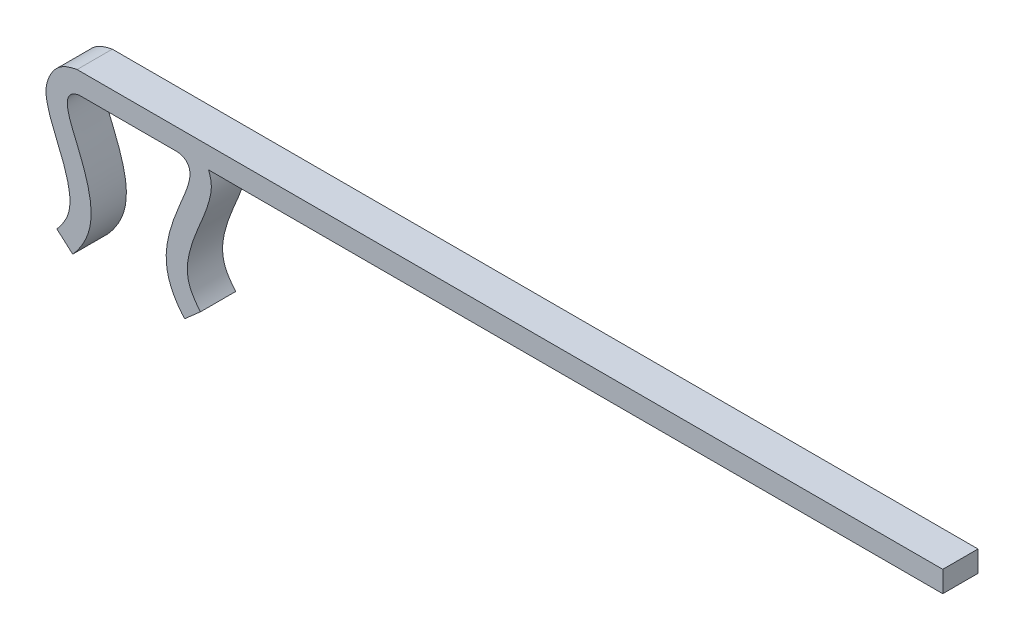
ISO-10303-21;
HEADER;
FILE_DESCRIPTION(('STEP AP214'),'2;1');
FILE_NAME('part.step','',(''),(''),'','','');
FILE_SCHEMA(('AUTOMOTIVE_DESIGN { 1 0 10303 214 1 1 1 1 }'));
ENDSEC;
DATA;
#1=APPLICATION_CONTEXT('core data for automotive mechanical design processes');
#2=APPLICATION_PROTOCOL_DEFINITION('international standard','automotive_design',2000,#1);
#3=PRODUCT_CONTEXT('',#1,'mechanical');
#4=PRODUCT('Part','Part','',(#3));
#5=PRODUCT_RELATED_PRODUCT_CATEGORY('part','',(#4));
#6=PRODUCT_DEFINITION_FORMATION('','',#4);
#7=PRODUCT_DEFINITION_CONTEXT('part definition',#1,'design');
#8=PRODUCT_DEFINITION('design','',#6,#7);
#9=PRODUCT_DEFINITION_SHAPE('','',#8);
#10=(LENGTH_UNIT() NAMED_UNIT(*) SI_UNIT(.MILLI.,.METRE.));
#11=(NAMED_UNIT(*) PLANE_ANGLE_UNIT() SI_UNIT($,.RADIAN.));
#12=(NAMED_UNIT(*) SI_UNIT($,.STERADIAN.) SOLID_ANGLE_UNIT());
#13=UNCERTAINTY_MEASURE_WITH_UNIT(LENGTH_MEASURE(1.E-05),#10,'distance_accuracy_value','');
#14=(GEOMETRIC_REPRESENTATION_CONTEXT(3) GLOBAL_UNCERTAINTY_ASSIGNED_CONTEXT((#13)) GLOBAL_UNIT_ASSIGNED_CONTEXT((#10,
#11,#12)) REPRESENTATION_CONTEXT('',''));
#15=CARTESIAN_POINT('',(0.,0.,0.));
#16=DIRECTION('',(0.,0.,1.));
#17=DIRECTION('',(1.,0.,0.));
#18=AXIS2_PLACEMENT_3D('',#15,#16,#17);
#19=CARTESIAN_POINT('',(0.,2.,0.5));
#20=DIRECTION('',(0.,1.,0.));
#21=DIRECTION('',(0.,0.,1.));
#22=AXIS2_PLACEMENT_3D('',#19,#20,#21);
#23=PLANE('',#22);
#24=DIRECTION('',(1.,0.,0.));
#25=VECTOR('',#24,1.);
#26=CARTESIAN_POINT('',(0.,2.,0.));
#27=LINE('',#26,#25);
#28=CARTESIAN_POINT('',(-0.704103554830341,2.,0.));
#29=VERTEX_POINT('',#28);
#30=CARTESIAN_POINT('',(0.704103554830341,2.,0.));
#31=VERTEX_POINT('',#30);
#32=EDGE_CURVE('E150',#29,#31,#27,.T.);
#33=ORIENTED_EDGE('',*,*,#32,.T.);
#34=DIRECTION('',(0.,0.,-1.));
#35=VECTOR('',#34,1.);
#36=CARTESIAN_POINT('',(0.704103554830341,2.,0.5));
#37=LINE('',#36,#35);
#38=CARTESIAN_POINT('',(0.704103554830341,2.,0.5));
#39=VERTEX_POINT('',#38);
#40=EDGE_CURVE('E11',#39,#31,#37,.T.);
#41=ORIENTED_EDGE('',*,*,#40,.F.);
#42=DIRECTION('',(1.,0.,0.));
#43=VECTOR('',#42,1.);
#44=CARTESIAN_POINT('',(0.,2.,0.5));
#45=LINE('',#44,#43);
#46=CARTESIAN_POINT('',(-0.704103554830341,2.,0.5));
#47=VERTEX_POINT('',#46);
#48=EDGE_CURVE('E257',#47,#39,#45,.T.);
#49=ORIENTED_EDGE('',*,*,#48,.F.);
#50=DIRECTION('',(0.,0.,-1.));
#51=VECTOR('',#50,1.);
#52=CARTESIAN_POINT('',(-0.704103554830341,2.,0.5));
#53=LINE('',#52,#51);
#54=EDGE_CURVE('E51',#47,#29,#53,.T.);
#55=ORIENTED_EDGE('',*,*,#54,.T.);
#56=EDGE_LOOP('',(#33,#41,#49,#55));
#57=FACE_BOUND('',#56,.T.);
#58=ADVANCED_FACE('F35',(#57),#23,.F.);
#59=CARTESIAN_POINT('',(0.704103554830341,2.,0.5));
#60=CARTESIAN_POINT('',(0.984913181641098,1.94760086543452,0.5));
#61=CARTESIAN_POINT('',(0.653467277190609,1.24609139151141,0.5));
#62=CARTESIAN_POINT('',(0.440470999248636,0.580993389089,0.5));
#63=CARTESIAN_POINT('',(0.657699292900203,0.154588796874847,0.5));
#64=CARTESIAN_POINT('',(0.793373681494978,0.,0.5));
#65=B_SPLINE_CURVE_WITH_KNOTS('',3,(#59,#60,#61,#62,#63,#64),.UNSPECIFIED.,.F.,.F.,(4,1,1,4),
(0.,0.31639063159696,0.760407920942743,1.),.UNSPECIFIED.);
#66=DIRECTION('',(0.,0.,-1.));
#67=VECTOR('',#66,1.);
#68=SURFACE_OF_LINEAR_EXTRUSION('',#65,#67);
#69=CARTESIAN_POINT('',(0.704103554830341,2.,0.));
#70=CARTESIAN_POINT('',(0.984913181641098,1.94760086543452,0.));
#71=CARTESIAN_POINT('',(0.653467277190609,1.24609139151141,0.));
#72=CARTESIAN_POINT('',(0.440470999248636,0.580993389089,0.));
#73=CARTESIAN_POINT('',(0.657699292900203,0.154588796874847,0.));
#74=CARTESIAN_POINT('',(0.793373681494978,0.,0.));
#75=B_SPLINE_CURVE_WITH_KNOTS('',3,(#69,#70,#71,#72,#73,#74),.UNSPECIFIED.,.F.,.F.,(4,1,1,4),
(0.,0.31639063159696,0.760407920942743,1.),.UNSPECIFIED.);
#76=CARTESIAN_POINT('',(0.793373681494978,0.,0.));
#77=VERTEX_POINT('',#76);
#78=EDGE_CURVE('E223',#31,#77,#75,.T.);
#79=ORIENTED_EDGE('',*,*,#78,.T.);
#80=DIRECTION('',(0.,0.,-1.));
#81=VECTOR('',#80,1.);
#82=CARTESIAN_POINT('',(0.793373681494978,0.,0.5));
#83=LINE('',#82,#81);
#84=CARTESIAN_POINT('',(0.793373681494978,0.,0.5));
#85=VERTEX_POINT('',#84);
#86=EDGE_CURVE('E43',#85,#77,#83,.T.);
#87=ORIENTED_EDGE('',*,*,#86,.F.);
#88=EDGE_CURVE('E95',#39,#85,#65,.T.);
#89=ORIENTED_EDGE('',*,*,#88,.F.);
#90=ORIENTED_EDGE('',*,*,#40,.T.);
#91=EDGE_LOOP('',(#79,#87,#89,#90));
#92=FACE_BOUND('',#91,.T.);
#93=ADVANCED_FACE('F269',(#92),#68,.F.);
#94=CARTESIAN_POINT('',(0.345206858334981,-0.39333225272412,0.5));
#95=DIRECTION('',(-0.659630628441679,0.751589937413771,0.));
#96=DIRECTION('',(-0.751589937413771,-0.659630628441679,0.));
#97=AXIS2_PLACEMENT_3D('',#94,#95,#96);
#98=PLANE('',#97);
#99=DIRECTION('',(0.751589937413771,0.659630628441679,0.));
#100=VECTOR('',#99,1.);
#101=CARTESIAN_POINT('',(0.345206858334981,-0.39333225272412,0.));
#102=LINE('',#101,#100);
#103=CARTESIAN_POINT('',(1.01885066271911,0.197889188532504,0.));
#104=VERTEX_POINT('',#103);
#105=EDGE_CURVE('E220',#77,#104,#102,.T.);
#106=ORIENTED_EDGE('',*,*,#105,.T.);
#107=DIRECTION('',(0.,0.,-1.));
#108=VECTOR('',#107,1.);
#109=CARTESIAN_POINT('',(1.01885066271911,0.197889188532504,0.5));
#110=LINE('',#109,#108);
#111=CARTESIAN_POINT('',(1.01885066271911,0.197889188532504,0.5));
#112=VERTEX_POINT('',#111);
#113=EDGE_CURVE('E213',#112,#104,#110,.T.);
#114=ORIENTED_EDGE('',*,*,#113,.F.);
#115=DIRECTION('',(0.751589937413771,0.659630628441679,0.));
#116=VECTOR('',#115,1.);
#117=CARTESIAN_POINT('',(0.345206858334981,-0.39333225272412,0.5));
#118=LINE('',#117,#116);
#119=EDGE_CURVE('E192',#85,#112,#118,.T.);
#120=ORIENTED_EDGE('',*,*,#119,.F.);
#121=ORIENTED_EDGE('',*,*,#86,.T.);
#122=EDGE_LOOP('',(#106,#114,#120,#121));
#123=FACE_BOUND('',#122,.T.);
#124=ADVANCED_FACE('F182',(#123),#98,.F.);
#125=CARTESIAN_POINT('',(1.13301343391473,2.,0.5));
#126=CARTESIAN_POINT('',(1.14554902716727,1.97008676745175,0.5));
#127=CARTESIAN_POINT('',(1.1868640117658,1.84095675577526,0.5));
#128=CARTESIAN_POINT('',(1.15703675964685,1.66091753888568,0.5));
#129=CARTESIAN_POINT('',(1.0748951891831,1.4074288063801,0.5));
#130=CARTESIAN_POINT('',(0.957177150795111,1.15393042408926,0.5));
#131=CARTESIAN_POINT('',(0.869904632965716,0.899603607723856,0.5));
#132=CARTESIAN_POINT('',(0.827560012778808,0.693214540194924,0.5));
#133=CARTESIAN_POINT('',(0.834928931904811,0.530060954744289,0.5));
#134=CARTESIAN_POINT('',(0.877452999577407,0.387206530249196,0.5));
#135=CARTESIAN_POINT('',(0.970734516998353,0.252713220606094,0.5));
#136=CARTESIAN_POINT('',(1.01885066271911,0.197889188532499,0.5));
#137=B_SPLINE_CURVE_WITH_KNOTS('',3,(#125,#126,#127,#128,#129,#130,#131,#132,#133,#134,#135,
#136),.UNSPECIFIED.,.F.,.F.,(4,1,1,1,1,1,1,1,1,4),(0.0969535397877384,0.116035266014388,
0.179175604156218,0.242315942298047,0.368596618581706,0.494877294865365,0.621157971149024,
0.747438647432682,0.873719323716341,1.),.UNSPECIFIED.);
#138=DIRECTION('',(0.,0.,-1.));
#139=VECTOR('',#138,1.);
#140=SURFACE_OF_LINEAR_EXTRUSION('',#137,#139);
#141=CARTESIAN_POINT('',(1.13301343391473,2.,0.));
#142=CARTESIAN_POINT('',(1.14554902716727,1.97008676745175,0.));
#143=CARTESIAN_POINT('',(1.1868640117658,1.84095675577526,0.));
#144=CARTESIAN_POINT('',(1.15703675964685,1.66091753888568,0.));
#145=CARTESIAN_POINT('',(1.0748951891831,1.4074288063801,0.));
#146=CARTESIAN_POINT('',(0.957177150795111,1.15393042408926,0.));
#147=CARTESIAN_POINT('',(0.869904632965716,0.899603607723856,0.));
#148=CARTESIAN_POINT('',(0.827560012778808,0.693214540194924,0.));
#149=CARTESIAN_POINT('',(0.834928931904811,0.530060954744289,0.));
#150=CARTESIAN_POINT('',(0.877452999577407,0.387206530249196,0.));
#151=CARTESIAN_POINT('',(0.970734516998353,0.252713220606094,0.));
#152=CARTESIAN_POINT('',(1.01885066271911,0.197889188532499,0.));
#153=B_SPLINE_CURVE_WITH_KNOTS('',3,(#141,#142,#143,#144,#145,#146,#147,#148,#149,#150,#151,
#152),.UNSPECIFIED.,.F.,.F.,(4,1,1,1,1,1,1,1,1,4),(0.0969535397877384,0.116035266014388,
0.179175604156218,0.242315942298047,0.368596618581706,0.494877294865365,0.621157971149024,
0.747438647432682,0.873719323716341,1.),.UNSPECIFIED.);
#154=CARTESIAN_POINT('',(1.13301343391473,2.,0.));
#155=VERTEX_POINT('',#154);
#156=EDGE_CURVE('E226',#155,#104,#153,.T.);
#157=ORIENTED_EDGE('',*,*,#156,.F.);
#158=DIRECTION('',(0.,0.,-1.));
#159=VECTOR('',#158,1.);
#160=CARTESIAN_POINT('',(1.13301343391473,2.,0.5));
#161=LINE('',#160,#159);
#162=CARTESIAN_POINT('',(1.13301343391473,2.,0.5));
#163=VERTEX_POINT('',#162);
#164=EDGE_CURVE('E211',#163,#155,#161,.T.);
#165=ORIENTED_EDGE('',*,*,#164,.F.);
#166=EDGE_CURVE('E184',#163,#112,#137,.T.);
#167=ORIENTED_EDGE('',*,*,#166,.T.);
#168=ORIENTED_EDGE('',*,*,#113,.T.);
#169=EDGE_LOOP('',(#157,#165,#167,#168));
#170=FACE_BOUND('',#169,.T.);
#171=ADVANCED_FACE('F177',(#170),#140,.T.);
#172=CARTESIAN_POINT('',(0.,2.,0.5));
#173=DIRECTION('',(0.,1.,0.));
#174=DIRECTION('',(0.,0.,1.));
#175=AXIS2_PLACEMENT_3D('',#172,#173,#174);
#176=PLANE('',#175);
#177=DIRECTION('',(1.,0.,0.));
#178=VECTOR('',#177,1.);
#179=CARTESIAN_POINT('',(0.,2.,0.));
#180=LINE('',#179,#178);
#181=CARTESIAN_POINT('',(11.55,2.,0.));
#182=VERTEX_POINT('',#181);
#183=EDGE_CURVE('E228',#155,#182,#180,.T.);
#184=ORIENTED_EDGE('',*,*,#183,.T.);
#185=DIRECTION('',(0.,0.,-1.));
#186=VECTOR('',#185,1.);
#187=CARTESIAN_POINT('',(11.55,2.,0.5));
#188=LINE('',#187,#186);
#189=CARTESIAN_POINT('',(11.55,2.,0.5));
#190=VERTEX_POINT('',#189);
#191=EDGE_CURVE('E206',#190,#182,#188,.T.);
#192=ORIENTED_EDGE('',*,*,#191,.F.);
#193=DIRECTION('',(1.,0.,0.));
#194=VECTOR('',#193,1.);
#195=CARTESIAN_POINT('',(0.,2.,0.5));
#196=LINE('',#195,#194);
#197=EDGE_CURVE('E191',#163,#190,#196,.T.);
#198=ORIENTED_EDGE('',*,*,#197,.F.);
#199=ORIENTED_EDGE('',*,*,#164,.T.);
#200=EDGE_LOOP('',(#184,#192,#198,#199));
#201=FACE_BOUND('',#200,.T.);
#202=ADVANCED_FACE('F173',(#201),#176,.F.);
#203=CARTESIAN_POINT('',(11.55,0.,0.5));
#204=DIRECTION('',(1.,0.,0.));
#205=DIRECTION('',(0.,0.,-1.));
#206=AXIS2_PLACEMENT_3D('',#203,#204,#205);
#207=PLANE('',#206);
#208=DIRECTION('',(0.,-1.,0.));
#209=VECTOR('',#208,1.);
#210=CARTESIAN_POINT('',(11.55,0.,0.));
#211=LINE('',#210,#209);
#212=CARTESIAN_POINT('',(11.55,2.3,0.));
#213=VERTEX_POINT('',#212);
#214=EDGE_CURVE('E240',#213,#182,#211,.T.);
#215=ORIENTED_EDGE('',*,*,#214,.F.);
#216=DIRECTION('',(0.,0.,-1.));
#217=VECTOR('',#216,1.);
#218=CARTESIAN_POINT('',(11.55,2.3,0.5));
#219=LINE('',#218,#217);
#220=CARTESIAN_POINT('',(11.55,2.3,0.5));
#221=VERTEX_POINT('',#220);
#222=EDGE_CURVE('E201',#221,#213,#219,.T.);
#223=ORIENTED_EDGE('',*,*,#222,.F.);
#224=DIRECTION('',(0.,-1.,0.));
#225=VECTOR('',#224,1.);
#226=CARTESIAN_POINT('',(11.55,0.,0.5));
#227=LINE('',#226,#225);
#228=EDGE_CURVE('E198',#221,#190,#227,.T.);
#229=ORIENTED_EDGE('',*,*,#228,.T.);
#230=ORIENTED_EDGE('',*,*,#191,.T.);
#231=EDGE_LOOP('',(#215,#223,#229,#230));
#232=FACE_BOUND('',#231,.T.);
#233=ADVANCED_FACE('F169',(#232),#207,.T.);
#234=CARTESIAN_POINT('',(0.,2.3,0.5));
#235=DIRECTION('',(0.,1.,0.));
#236=DIRECTION('',(-1.,0.,0.));
#237=AXIS2_PLACEMENT_3D('',#234,#235,#236);
#238=PLANE('',#237);
#239=DIRECTION('',(1.,0.,0.));
#240=VECTOR('',#239,1.);
#241=CARTESIAN_POINT('',(0.,2.3,0.));
#242=LINE('',#241,#240);
#243=CARTESIAN_POINT('',(-0.73185408703074,2.3,0.));
#244=VERTEX_POINT('',#243);
#245=EDGE_CURVE('E204',#244,#213,#242,.T.);
#246=ORIENTED_EDGE('',*,*,#245,.F.);
#247=DIRECTION('',(0.,0.,-1.));
#248=VECTOR('',#247,1.);
#249=CARTESIAN_POINT('',(-0.73185408703074,2.3,0.5));
#250=LINE('',#249,#248);
#251=CARTESIAN_POINT('',(-0.73185408703074,2.3,0.5));
#252=VERTEX_POINT('',#251);
#253=EDGE_CURVE('E136',#252,#244,#250,.T.);
#254=ORIENTED_EDGE('',*,*,#253,.F.);
#255=DIRECTION('',(1.,0.,0.));
#256=VECTOR('',#255,1.);
#257=CARTESIAN_POINT('',(0.,2.3,0.5));
#258=LINE('',#257,#256);
#259=EDGE_CURVE('E126',#252,#221,#258,.T.);
#260=ORIENTED_EDGE('',*,*,#259,.T.);
#261=ORIENTED_EDGE('',*,*,#222,.T.);
#262=EDGE_LOOP('',(#246,#254,#260,#261));
#263=FACE_BOUND('',#262,.T.);
#264=ADVANCED_FACE('F166',(#263),#238,.T.);
#265=CARTESIAN_POINT('',(-0.73185408703074,2.3,0.5));
#266=CARTESIAN_POINT('',(-0.749651333704803,2.29667903008184,0.5));
#267=CARTESIAN_POINT('',(-0.778982171372845,2.29218016393795,0.5));
#268=CARTESIAN_POINT('',(-0.88696880949107,2.26194383568389,0.5));
#269=CARTESIAN_POINT('',(-1.05672957902355,2.17150862815143,0.5));
#270=CARTESIAN_POINT('',(-1.19590450675407,1.89552573490388,0.5));
#271=CARTESIAN_POINT('',(-1.15703676406827,1.66091753846808,0.5));
#272=CARTESIAN_POINT('',(-1.07489519283845,1.40742880621073,0.5));
#273=CARTESIAN_POINT('',(-0.957177153684365,1.15393042427565,0.5));
#274=CARTESIAN_POINT('',(-0.869904635086368,0.899603608173992,0.5));
#275=CARTESIAN_POINT('',(-0.82756001427573,0.69321454077303,0.5));
#276=CARTESIAN_POINT('',(-0.834928932908666,0.530060955300125,0.5));
#277=CARTESIAN_POINT('',(-0.877453000149541,0.38720653067652,0.5));
#278=CARTESIAN_POINT('',(-0.970734517164034,0.252713220751511,0.5));
#279=CARTESIAN_POINT('',(-1.01885066271911,0.197889188532504,0.5));
#280=B_SPLINE_CURVE_WITH_KNOTS('',3,(#265,#266,#267,#268,#269,#270,#271,#272,#273,#274,#275,
#276,#277,#278,#279),.UNSPECIFIED.,.F.,.F.,(4,1,1,1,1,1,1,1,1,1,1,1,4),(-0.0102454102692706,
0.00553967426618679,0.0213247588016441,0.0528949278725588,0.116035266014388,0.179175604156218,
0.242315942298047,0.368596618581706,0.494877294865365,0.621157971149024,0.747438647432682,
0.873719323716341,1.),.UNSPECIFIED.);
#281=DIRECTION('',(0.,0.,-1.));
#282=VECTOR('',#281,1.);
#283=SURFACE_OF_LINEAR_EXTRUSION('',#280,#282);
#284=CARTESIAN_POINT('',(-0.73185408703074,2.3,0.));
#285=CARTESIAN_POINT('',(-0.749651333704803,2.29667903008184,0.));
#286=CARTESIAN_POINT('',(-0.778982171372845,2.29218016393795,0.));
#287=CARTESIAN_POINT('',(-0.88696880949107,2.26194383568389,0.));
#288=CARTESIAN_POINT('',(-1.05672957902355,2.17150862815143,0.));
#289=CARTESIAN_POINT('',(-1.19590450675407,1.89552573490388,0.));
#290=CARTESIAN_POINT('',(-1.15703676406827,1.66091753846808,0.));
#291=CARTESIAN_POINT('',(-1.07489519283845,1.40742880621073,0.));
#292=CARTESIAN_POINT('',(-0.957177153684365,1.15393042427565,0.));
#293=CARTESIAN_POINT('',(-0.869904635086368,0.899603608173992,0.));
#294=CARTESIAN_POINT('',(-0.82756001427573,0.69321454077303,0.));
#295=CARTESIAN_POINT('',(-0.834928932908666,0.530060955300125,0.));
#296=CARTESIAN_POINT('',(-0.877453000149541,0.38720653067652,0.));
#297=CARTESIAN_POINT('',(-0.970734517164034,0.252713220751511,0.));
#298=CARTESIAN_POINT('',(-1.01885066271911,0.197889188532504,0.));
#299=B_SPLINE_CURVE_WITH_KNOTS('',3,(#284,#285,#286,#287,#288,#289,#290,#291,#292,#293,#294,
#295,#296,#297,#298),.UNSPECIFIED.,.F.,.F.,(4,1,1,1,1,1,1,1,1,1,1,1,4),(-0.0102454102692706,
0.00553967426618679,0.0213247588016441,0.0528949278725588,0.116035266014388,0.179175604156218,
0.242315942298047,0.368596618581706,0.494877294865365,0.621157971149024,0.747438647432682,
0.873719323716341,1.),.UNSPECIFIED.);
#300=CARTESIAN_POINT('',(-1.01885066271911,0.197889188532504,0.));
#301=VERTEX_POINT('',#300);
#302=EDGE_CURVE('E133',#244,#301,#299,.T.);
#303=ORIENTED_EDGE('',*,*,#302,.T.);
#304=DIRECTION('',(0.,0.,-1.));
#305=VECTOR('',#304,1.);
#306=CARTESIAN_POINT('',(-1.01885066271911,0.197889188532504,0.5));
#307=LINE('',#306,#305);
#308=CARTESIAN_POINT('',(-1.01885066271911,0.197889188532504,0.5));
#309=VERTEX_POINT('',#308);
#310=EDGE_CURVE('E130',#309,#301,#307,.T.);
#311=ORIENTED_EDGE('',*,*,#310,.F.);
#312=EDGE_CURVE('E118',#252,#309,#280,.T.);
#313=ORIENTED_EDGE('',*,*,#312,.F.);
#314=ORIENTED_EDGE('',*,*,#253,.T.);
#315=EDGE_LOOP('',(#303,#311,#313,#314));
#316=FACE_BOUND('',#315,.T.);
#317=ADVANCED_FACE('F131',(#316),#283,.F.);
#318=CARTESIAN_POINT('',(-0.345206858334981,-0.39333225272412,0.5));
#319=DIRECTION('',(-0.659630628441679,-0.751589937413771,0.));
#320=DIRECTION('',(0.751589937413771,-0.659630628441679,0.));
#321=AXIS2_PLACEMENT_3D('',#318,#319,#320);
#322=PLANE('',#321);
#323=DIRECTION('',(-0.751589937413771,0.659630628441679,0.));
#324=VECTOR('',#323,1.);
#325=CARTESIAN_POINT('',(-0.345206858334981,-0.39333225272412,0.));
#326=LINE('',#325,#324);
#327=CARTESIAN_POINT('',(-0.793373681494978,0.,0.));
#328=VERTEX_POINT('',#327);
#329=EDGE_CURVE('E247',#328,#301,#326,.T.);
#330=ORIENTED_EDGE('',*,*,#329,.F.);
#331=DIRECTION('',(0.,0.,-1.));
#332=VECTOR('',#331,1.);
#333=CARTESIAN_POINT('',(-0.793373681494978,0.,0.5));
#334=LINE('',#333,#332);
#335=CARTESIAN_POINT('',(-0.793373681494978,0.,0.5));
#336=VERTEX_POINT('',#335);
#337=EDGE_CURVE('E83',#336,#328,#334,.T.);
#338=ORIENTED_EDGE('',*,*,#337,.F.);
#339=DIRECTION('',(-0.751589937413771,0.659630628441679,0.));
#340=VECTOR('',#339,1.);
#341=CARTESIAN_POINT('',(-0.345206858334981,-0.39333225272412,0.5));
#342=LINE('',#341,#340);
#343=EDGE_CURVE('E123',#336,#309,#342,.T.);
#344=ORIENTED_EDGE('',*,*,#343,.T.);
#345=ORIENTED_EDGE('',*,*,#310,.T.);
#346=EDGE_LOOP('',(#330,#338,#344,#345));
#347=FACE_BOUND('',#346,.T.);
#348=ADVANCED_FACE('F138',(#347),#322,.T.);
#349=CARTESIAN_POINT('',(-0.704103554830341,2.,0.5));
#350=CARTESIAN_POINT('',(-0.984913181641097,1.94760086543452,0.5));
#351=CARTESIAN_POINT('',(-0.653467277190609,1.24609139151141,0.5));
#352=CARTESIAN_POINT('',(-0.440470999248635,0.580993389088999,0.5));
#353=CARTESIAN_POINT('',(-0.657699292900203,0.154588796874847,0.5));
#354=CARTESIAN_POINT('',(-0.793373681494978,0.,0.5));
#355=B_SPLINE_CURVE_WITH_KNOTS('',3,(#349,#350,#351,#352,#353,#354),.UNSPECIFIED.,.F.,.F.,(4,1,
1,4),(0.,0.31639063159696,0.760407920942743,1.),.UNSPECIFIED.);
#356=DIRECTION('',(0.,0.,-1.));
#357=VECTOR('',#356,1.);
#358=SURFACE_OF_LINEAR_EXTRUSION('',#355,#357);
#359=CARTESIAN_POINT('',(-0.704103554830341,2.,0.));
#360=CARTESIAN_POINT('',(-0.984913181641097,1.94760086543452,0.));
#361=CARTESIAN_POINT('',(-0.653467277190609,1.24609139151141,0.));
#362=CARTESIAN_POINT('',(-0.440470999248635,0.580993389088999,0.));
#363=CARTESIAN_POINT('',(-0.657699292900203,0.154588796874847,0.));
#364=CARTESIAN_POINT('',(-0.793373681494978,0.,0.));
#365=B_SPLINE_CURVE_WITH_KNOTS('',3,(#359,#360,#361,#362,#363,#364),.UNSPECIFIED.,.F.,.F.,(4,1,
1,4),(0.,0.31639063159696,0.760407920942743,1.),.UNSPECIFIED.);
#366=EDGE_CURVE('E252',#29,#328,#365,.T.);
#367=ORIENTED_EDGE('',*,*,#366,.F.);
#368=ORIENTED_EDGE('',*,*,#54,.F.);
#369=EDGE_CURVE('E139',#47,#336,#355,.T.);
#370=ORIENTED_EDGE('',*,*,#369,.T.);
#371=ORIENTED_EDGE('',*,*,#337,.T.);
#372=EDGE_LOOP('',(#367,#368,#370,#371));
#373=FACE_BOUND('',#372,.T.);
#374=ADVANCED_FACE('F156',(#373),#358,.T.);
#375=CARTESIAN_POINT('',(0.,0.,0.5));
#376=DIRECTION('',(0.,0.,1.));
#377=DIRECTION('',(1.,0.,0.));
#378=AXIS2_PLACEMENT_3D('',#375,#376,#377);
#379=PLANE('',#378);
#380=ORIENTED_EDGE('',*,*,#48,.T.);
#381=ORIENTED_EDGE('',*,*,#88,.T.);
#382=ORIENTED_EDGE('',*,*,#119,.T.);
#383=ORIENTED_EDGE('',*,*,#166,.F.);
#384=ORIENTED_EDGE('',*,*,#197,.T.);
#385=ORIENTED_EDGE('',*,*,#228,.F.);
#386=ORIENTED_EDGE('',*,*,#259,.F.);
#387=ORIENTED_EDGE('',*,*,#312,.T.);
#388=ORIENTED_EDGE('',*,*,#343,.F.);
#389=ORIENTED_EDGE('',*,*,#369,.F.);
#390=EDGE_LOOP('',(#380,#381,#382,#383,#384,#385,#386,#387,#388,#389));
#391=FACE_BOUND('',#390,.T.);
#392=ADVANCED_FACE('F120',(#391),#379,.T.);
#393=CARTESIAN_POINT('',(0.,0.,0.));
#394=DIRECTION('',(0.,0.,1.));
#395=DIRECTION('',(1.,0.,0.));
#396=AXIS2_PLACEMENT_3D('',#393,#394,#395);
#397=PLANE('',#396);
#398=ORIENTED_EDGE('',*,*,#32,.F.);
#399=ORIENTED_EDGE('',*,*,#366,.T.);
#400=ORIENTED_EDGE('',*,*,#329,.T.);
#401=ORIENTED_EDGE('',*,*,#302,.F.);
#402=ORIENTED_EDGE('',*,*,#245,.T.);
#403=ORIENTED_EDGE('',*,*,#214,.T.);
#404=ORIENTED_EDGE('',*,*,#183,.F.);
#405=ORIENTED_EDGE('',*,*,#156,.T.);
#406=ORIENTED_EDGE('',*,*,#105,.F.);
#407=ORIENTED_EDGE('',*,*,#78,.F.);
#408=EDGE_LOOP('',(#398,#399,#400,#401,#402,#403,#404,#405,#406,#407));
#409=FACE_BOUND('',#408,.T.);
#410=ADVANCED_FACE('F160',(#409),#397,.F.);
#411=CLOSED_SHELL('',(#58,#93,#124,#171,#202,#233,#264,#317,#348,#374,#392,#410));
#412=MANIFOLD_SOLID_BREP('B2',#411);
#413=ADVANCED_BREP_SHAPE_REPRESENTATION('',(#18,#412),#14);
#414=SHAPE_DEFINITION_REPRESENTATION(#9,#413);
ENDSEC;
END-ISO-10303-21;
